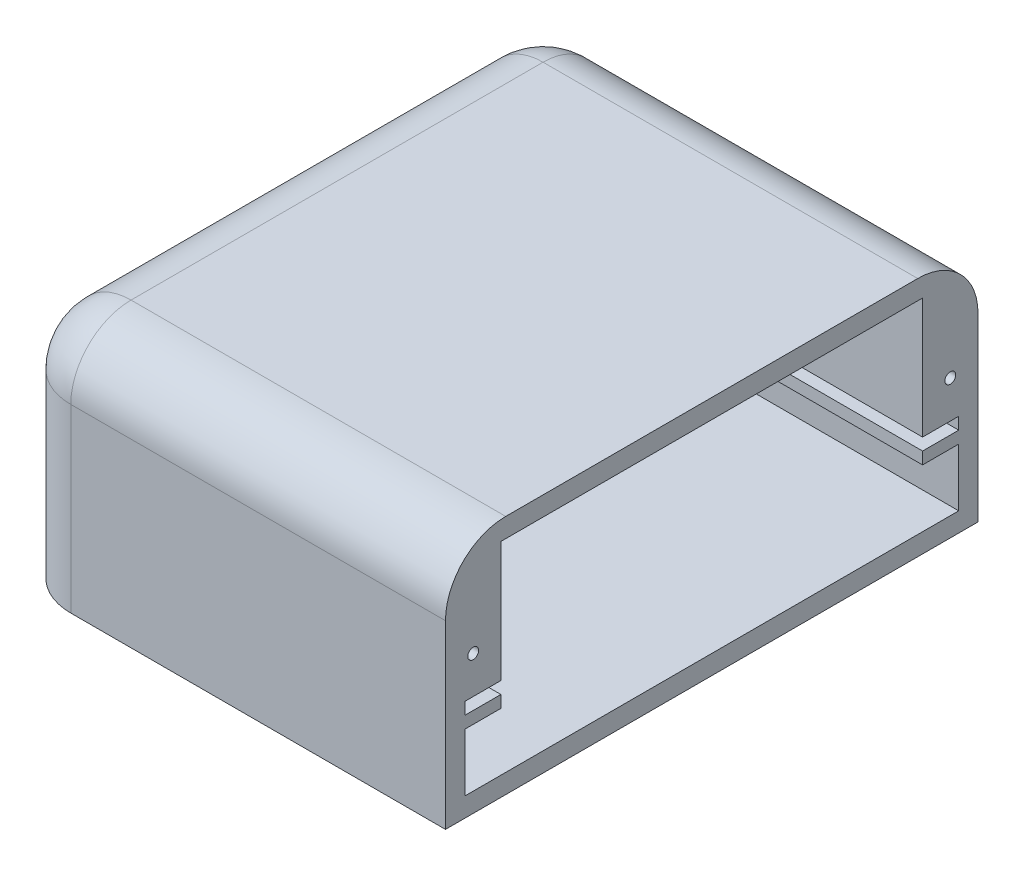
ISO-10303-21;
HEADER;
FILE_DESCRIPTION(('STEP AP214'),'2;1');
FILE_NAME('part.step','',(''),(''),'','','');
FILE_SCHEMA(('AUTOMOTIVE_DESIGN { 1 0 10303 214 1 1 1 1 }'));
ENDSEC;
DATA;
#1=APPLICATION_CONTEXT('core data for automotive mechanical design processes');
#2=APPLICATION_PROTOCOL_DEFINITION('international standard','automotive_design',2000,#1);
#3=PRODUCT_CONTEXT('',#1,'mechanical');
#4=PRODUCT('Part','Part','',(#3));
#5=PRODUCT_RELATED_PRODUCT_CATEGORY('part','',(#4));
#6=PRODUCT_DEFINITION_FORMATION('','',#4);
#7=PRODUCT_DEFINITION_CONTEXT('part definition',#1,'design');
#8=PRODUCT_DEFINITION('design','',#6,#7);
#9=PRODUCT_DEFINITION_SHAPE('','',#8);
#10=(LENGTH_UNIT() NAMED_UNIT(*) SI_UNIT(.MILLI.,.METRE.));
#11=(NAMED_UNIT(*) PLANE_ANGLE_UNIT() SI_UNIT($,.RADIAN.));
#12=(NAMED_UNIT(*) SI_UNIT($,.STERADIAN.) SOLID_ANGLE_UNIT());
#13=UNCERTAINTY_MEASURE_WITH_UNIT(LENGTH_MEASURE(1.E-05),#10,'distance_accuracy_value','');
#14=(GEOMETRIC_REPRESENTATION_CONTEXT(3) GLOBAL_UNCERTAINTY_ASSIGNED_CONTEXT((#13)) GLOBAL_UNIT_ASSIGNED_CONTEXT((#10,
#11,#12)) REPRESENTATION_CONTEXT('',''));
#15=CARTESIAN_POINT('',(0.,0.,0.));
#16=DIRECTION('',(0.,0.,1.));
#17=DIRECTION('',(1.,0.,0.));
#18=AXIS2_PLACEMENT_3D('',#15,#16,#17);
#19=CARTESIAN_POINT('',(72.2,40.,0.));
#20=DIRECTION('',(-1.,0.,0.));
#21=DIRECTION('',(0.,0.,1.));
#22=AXIS2_PLACEMENT_3D('',#19,#20,#21);
#23=PLANE('',#22);
#24=DIRECTION('',(0.,-1.,0.));
#25=VECTOR('',#24,1.);
#26=CARTESIAN_POINT('',(72.2,0.,-79.2));
#27=LINE('',#26,#25);
#28=CARTESIAN_POINT('',(72.2,36.8,-79.2));
#29=VERTEX_POINT('',#28);
#30=CARTESIAN_POINT('',(72.2,16.8,-79.2));
#31=VERTEX_POINT('',#30);
#32=EDGE_CURVE('E221',#29,#31,#27,.T.);
#33=ORIENTED_EDGE('',*,*,#32,.T.);
#34=DIRECTION('',(0.,0.,1.));
#35=VECTOR('',#34,1.);
#36=CARTESIAN_POINT('',(72.2,16.8,0.));
#37=LINE('',#36,#35);
#38=CARTESIAN_POINT('',(72.2,16.8,-85.2));
#39=VERTEX_POINT('',#38);
#40=EDGE_CURVE('E230',#39,#31,#37,.T.);
#41=ORIENTED_EDGE('',*,*,#40,.F.);
#42=DIRECTION('',(0.,1.,0.));
#43=VECTOR('',#42,1.);
#44=CARTESIAN_POINT('',(72.2,0.,-85.2));
#45=LINE('',#44,#43);
#46=CARTESIAN_POINT('',(72.2,14.8,-85.2));
#47=VERTEX_POINT('',#46);
#48=EDGE_CURVE('E234',#47,#39,#45,.T.);
#49=ORIENTED_EDGE('',*,*,#48,.F.);
#50=DIRECTION('',(0.,0.,1.));
#51=VECTOR('',#50,1.);
#52=CARTESIAN_POINT('',(72.2,14.8,0.));
#53=LINE('',#52,#51);
#54=CARTESIAN_POINT('',(72.2,14.8,-79.2));
#55=VERTEX_POINT('',#54);
#56=EDGE_CURVE('E327',#47,#55,#53,.T.);
#57=ORIENTED_EDGE('',*,*,#56,.T.);
#58=DIRECTION('',(0.,-1.,0.));
#59=VECTOR('',#58,1.);
#60=CARTESIAN_POINT('',(72.2,0.,-79.2));
#61=LINE('',#60,#59);
#62=CARTESIAN_POINT('',(72.2,12.8,-79.2));
#63=VERTEX_POINT('',#62);
#64=EDGE_CURVE('E323',#55,#63,#61,.T.);
#65=ORIENTED_EDGE('',*,*,#64,.T.);
#66=DIRECTION('',(0.,0.,1.));
#67=VECTOR('',#66,1.);
#68=CARTESIAN_POINT('',(72.2,12.8,0.));
#69=LINE('',#68,#67);
#70=CARTESIAN_POINT('',(72.2,12.8,-85.2));
#71=VERTEX_POINT('',#70);
#72=EDGE_CURVE('E319',#71,#63,#69,.T.);
#73=ORIENTED_EDGE('',*,*,#72,.F.);
#74=CARTESIAN_POINT('',(72.2,3.2,-85.2));
#75=VERTEX_POINT('',#74);
#76=EDGE_CURVE('E315',#75,#71,#45,.T.);
#77=ORIENTED_EDGE('',*,*,#76,.F.);
#78=DIRECTION('',(0.,0.,-1.));
#79=VECTOR('',#78,1.);
#80=CARTESIAN_POINT('',(72.2,3.2,0.));
#81=LINE('',#80,#79);
#82=CARTESIAN_POINT('',(72.2,3.2,-3.2));
#83=VERTEX_POINT('',#82);
#84=EDGE_CURVE('E311',#83,#75,#81,.T.);
#85=ORIENTED_EDGE('',*,*,#84,.F.);
#86=DIRECTION('',(0.,1.,0.));
#87=VECTOR('',#86,1.);
#88=CARTESIAN_POINT('',(72.2,0.,-3.2));
#89=LINE('',#88,#87);
#90=CARTESIAN_POINT('',(72.2,12.8,-3.2));
#91=VERTEX_POINT('',#90);
#92=EDGE_CURVE('E299',#83,#91,#89,.T.);
#93=ORIENTED_EDGE('',*,*,#92,.T.);
#94=DIRECTION('',(0.,0.,-1.));
#95=VECTOR('',#94,1.);
#96=CARTESIAN_POINT('',(72.2,12.8,0.));
#97=LINE('',#96,#95);
#98=CARTESIAN_POINT('',(72.2,12.8,-9.2));
#99=VERTEX_POINT('',#98);
#100=EDGE_CURVE('E307',#91,#99,#97,.T.);
#101=ORIENTED_EDGE('',*,*,#100,.T.);
#102=DIRECTION('',(0.,-1.,0.));
#103=VECTOR('',#102,1.);
#104=CARTESIAN_POINT('',(72.2,0.,-9.2));
#105=LINE('',#104,#103);
#106=CARTESIAN_POINT('',(72.2,14.8,-9.2));
#107=VERTEX_POINT('',#106);
#108=EDGE_CURVE('E303',#107,#99,#105,.T.);
#109=ORIENTED_EDGE('',*,*,#108,.F.);
#110=DIRECTION('',(0.,0.,-1.));
#111=VECTOR('',#110,1.);
#112=CARTESIAN_POINT('',(72.2,14.8,0.));
#113=LINE('',#112,#111);
#114=CARTESIAN_POINT('',(72.2,14.8,-3.2));
#115=VERTEX_POINT('',#114);
#116=EDGE_CURVE('E298',#115,#107,#113,.T.);
#117=ORIENTED_EDGE('',*,*,#116,.F.);
#118=CARTESIAN_POINT('',(72.2,16.8,-3.2));
#119=VERTEX_POINT('',#118);
#120=EDGE_CURVE('E294',#115,#119,#89,.T.);
#121=ORIENTED_EDGE('',*,*,#120,.T.);
#122=DIRECTION('',(0.,0.,-1.));
#123=VECTOR('',#122,1.);
#124=CARTESIAN_POINT('',(72.2,16.8,0.));
#125=LINE('',#124,#123);
#126=CARTESIAN_POINT('',(72.2,16.8,-9.2));
#127=VERTEX_POINT('',#126);
#128=EDGE_CURVE('E290',#119,#127,#125,.T.);
#129=ORIENTED_EDGE('',*,*,#128,.T.);
#130=DIRECTION('',(0.,-1.,0.));
#131=VECTOR('',#130,1.);
#132=CARTESIAN_POINT('',(72.2,0.,-9.20000000000001));
#133=LINE('',#132,#131);
#134=CARTESIAN_POINT('',(72.2,36.8,-9.2));
#135=VERTEX_POINT('',#134);
#136=EDGE_CURVE('E286',#135,#127,#133,.T.);
#137=ORIENTED_EDGE('',*,*,#136,.F.);
#138=DIRECTION('',(0.,0.,-1.));
#139=VECTOR('',#138,1.);
#140=CARTESIAN_POINT('',(72.2,36.8,0.));
#141=LINE('',#140,#139);
#142=EDGE_CURVE('E283',#135,#29,#141,.T.);
#143=ORIENTED_EDGE('',*,*,#142,.T.);
#144=EDGE_LOOP('',(#33,#41,#49,#57,#65,#73,#77,#85,#93,#101,#109,#117,#121,#129,#137,#143));
#145=FACE_BOUND('',#144,.T.);
#146=DIRECTION('',(0.,0.,-1.));
#147=VECTOR('',#146,1.);
#148=CARTESIAN_POINT('',(72.2,40.,0.));
#149=LINE('',#148,#147);
#150=CARTESIAN_POINT('',(72.2,40.,-10.));
#151=VERTEX_POINT('',#150);
#152=CARTESIAN_POINT('',(72.2,40.,-78.4));
#153=VERTEX_POINT('',#152);
#154=EDGE_CURVE('E376',#151,#153,#149,.T.);
#155=ORIENTED_EDGE('',*,*,#154,.F.);
#156=CARTESIAN_POINT('',(72.2,30.,-10.));
#157=DIRECTION('',(-1.,0.,0.));
#158=DIRECTION('',(0.,0.,1.));
#159=AXIS2_PLACEMENT_3D('',#156,#157,#158);
#160=CIRCLE('',#159,10.);
#161=CARTESIAN_POINT('',(72.2,30.,0.));
#162=VERTEX_POINT('',#161);
#163=EDGE_CURVE('E11',#151,#162,#160,.F.);
#164=ORIENTED_EDGE('',*,*,#163,.T.);
#165=DIRECTION('',(0.,-1.,0.));
#166=VECTOR('',#165,1.);
#167=CARTESIAN_POINT('',(72.2,40.,0.));
#168=LINE('',#167,#166);
#169=CARTESIAN_POINT('',(72.2,0.,0.));
#170=VERTEX_POINT('',#169);
#171=EDGE_CURVE('E397',#162,#170,#168,.T.);
#172=ORIENTED_EDGE('',*,*,#171,.T.);
#173=DIRECTION('',(0.,0.,-1.));
#174=VECTOR('',#173,1.);
#175=CARTESIAN_POINT('',(72.2,0.,0.));
#176=LINE('',#175,#174);
#177=CARTESIAN_POINT('',(72.2,0.,-88.4));
#178=VERTEX_POINT('',#177);
#179=EDGE_CURVE('E388',#170,#178,#176,.T.);
#180=ORIENTED_EDGE('',*,*,#179,.T.);
#181=DIRECTION('',(0.,-1.,0.));
#182=VECTOR('',#181,1.);
#183=CARTESIAN_POINT('',(72.2,40.,-88.4));
#184=LINE('',#183,#182);
#185=CARTESIAN_POINT('',(72.2,30.,-88.4));
#186=VERTEX_POINT('',#185);
#187=EDGE_CURVE('E379',#186,#178,#184,.T.);
#188=ORIENTED_EDGE('',*,*,#187,.F.);
#189=CARTESIAN_POINT('',(72.2,30.,-78.4));
#190=DIRECTION('',(-1.,0.,0.));
#191=DIRECTION('',(0.,0.,1.));
#192=AXIS2_PLACEMENT_3D('',#189,#190,#191);
#193=CIRCLE('',#192,10.);
#194=EDGE_CURVE('E49',#186,#153,#193,.F.);
#195=ORIENTED_EDGE('',*,*,#194,.T.);
#196=EDGE_LOOP('',(#155,#164,#172,#180,#188,#195));
#197=FACE_BOUND('',#196,.T.);
#198=CARTESIAN_POINT('',(72.2,23.,-83.8));
#199=DIRECTION('',(1.,0.,0.));
#200=DIRECTION('',(0.,0.,-1.));
#201=AXIS2_PLACEMENT_3D('',#198,#199,#200);
#202=CIRCLE('',#201,0.900000000000003);
#203=CARTESIAN_POINT('',(72.2,23.,-84.7));
#204=VERTEX_POINT('',#203);
#205=EDGE_CURVE('E237',#204,#204,#202,.F.);
#206=ORIENTED_EDGE('',*,*,#205,.T.);
#207=EDGE_LOOP('',(#206));
#208=FACE_BOUND('',#207,.T.);
#209=CARTESIAN_POINT('',(72.2,23.,-4.6));
#210=DIRECTION('',(1.,0.,0.));
#211=DIRECTION('',(0.,0.,-1.));
#212=AXIS2_PLACEMENT_3D('',#209,#210,#211);
#213=CIRCLE('',#212,0.9);
#214=CARTESIAN_POINT('',(72.2,23.,-5.5));
#215=VERTEX_POINT('',#214);
#216=EDGE_CURVE('E598',#215,#215,#213,.T.);
#217=ORIENTED_EDGE('',*,*,#216,.F.);
#218=EDGE_LOOP('',(#217));
#219=FACE_BOUND('',#218,.T.);
#220=ADVANCED_FACE('F39',(#145,#197,#208,#219),#23,.F.);
#221=CARTESIAN_POINT('',(0.,40.,0.));
#222=DIRECTION('',(1.,0.,0.));
#223=DIRECTION('',(0.,0.,-1.));
#224=AXIS2_PLACEMENT_3D('',#221,#222,#223);
#225=PLANE('',#224);
#226=DIRECTION('',(0.,0.,1.));
#227=VECTOR('',#226,1.);
#228=CARTESIAN_POINT('',(0.,0.,0.));
#229=LINE('',#228,#227);
#230=CARTESIAN_POINT('',(0.,0.,-78.4));
#231=VERTEX_POINT('',#230);
#232=CARTESIAN_POINT('',(0.,0.,-10.));
#233=VERTEX_POINT('',#232);
#234=EDGE_CURVE('E334',#231,#233,#229,.T.);
#235=ORIENTED_EDGE('',*,*,#234,.T.);
#236=DIRECTION('',(0.,-1.,0.));
#237=VECTOR('',#236,1.);
#238=CARTESIAN_POINT('',(0.,40.,-10.));
#239=LINE('',#238,#237);
#240=CARTESIAN_POINT('',(0.,30.,-10.));
#241=VERTEX_POINT('',#240);
#242=EDGE_CURVE('E419',#233,#241,#239,.F.);
#243=ORIENTED_EDGE('',*,*,#242,.T.);
#244=DIRECTION('',(0.,0.,1.));
#245=VECTOR('',#244,1.);
#246=CARTESIAN_POINT('',(0.,30.,0.));
#247=LINE('',#246,#245);
#248=CARTESIAN_POINT('',(0.,30.,-78.4));
#249=VERTEX_POINT('',#248);
#250=EDGE_CURVE('E413',#241,#249,#247,.F.);
#251=ORIENTED_EDGE('',*,*,#250,.T.);
#252=DIRECTION('',(0.,-1.,0.));
#253=VECTOR('',#252,1.);
#254=CARTESIAN_POINT('',(0.,40.,-78.4));
#255=LINE('',#254,#253);
#256=EDGE_CURVE('E416',#249,#231,#255,.T.);
#257=ORIENTED_EDGE('',*,*,#256,.T.);
#258=EDGE_LOOP('',(#235,#243,#251,#257));
#259=FACE_BOUND('',#258,.T.);
#260=ADVANCED_FACE('F499',(#259),#225,.F.);
#261=CARTESIAN_POINT('',(0.,40.,0.));
#262=DIRECTION('',(0.,0.,-1.));
#263=DIRECTION('',(-1.,0.,0.));
#264=AXIS2_PLACEMENT_3D('',#261,#262,#263);
#265=PLANE('',#264);
#266=DIRECTION('',(1.,0.,0.));
#267=VECTOR('',#266,1.);
#268=CARTESIAN_POINT('',(0.,30.,0.));
#269=LINE('',#268,#267);
#270=CARTESIAN_POINT('',(10.,30.,0.));
#271=VERTEX_POINT('',#270);
#272=EDGE_CURVE('E400',#162,#271,#269,.F.);
#273=ORIENTED_EDGE('',*,*,#272,.T.);
#274=DIRECTION('',(0.,-1.,0.));
#275=VECTOR('',#274,1.);
#276=CARTESIAN_POINT('',(10.,40.,0.));
#277=LINE('',#276,#275);
#278=CARTESIAN_POINT('',(10.,0.,0.));
#279=VERTEX_POINT('',#278);
#280=EDGE_CURVE('E403',#271,#279,#277,.T.);
#281=ORIENTED_EDGE('',*,*,#280,.T.);
#282=DIRECTION('',(1.,0.,0.));
#283=VECTOR('',#282,1.);
#284=CARTESIAN_POINT('',(0.,0.,0.));
#285=LINE('',#284,#283);
#286=EDGE_CURVE('E384',#279,#170,#285,.T.);
#287=ORIENTED_EDGE('',*,*,#286,.T.);
#288=ORIENTED_EDGE('',*,*,#171,.F.);
#289=EDGE_LOOP('',(#273,#281,#287,#288));
#290=FACE_BOUND('',#289,.T.);
#291=ADVANCED_FACE('F503',(#290),#265,.F.);
#292=CARTESIAN_POINT('',(0.,40.,-88.4));
#293=DIRECTION('',(0.,0.,1.));
#294=DIRECTION('',(1.,0.,0.));
#295=AXIS2_PLACEMENT_3D('',#292,#293,#294);
#296=PLANE('',#295);
#297=DIRECTION('',(-1.,0.,0.));
#298=VECTOR('',#297,1.);
#299=CARTESIAN_POINT('',(0.,0.,-88.4));
#300=LINE('',#299,#298);
#301=CARTESIAN_POINT('',(10.,0.,-88.4));
#302=VERTEX_POINT('',#301);
#303=EDGE_CURVE('E380',#178,#302,#300,.T.);
#304=ORIENTED_EDGE('',*,*,#303,.T.);
#305=DIRECTION('',(0.,-1.,0.));
#306=VECTOR('',#305,1.);
#307=CARTESIAN_POINT('',(10.,40.,-88.4));
#308=LINE('',#307,#306);
#309=CARTESIAN_POINT('',(10.,30.,-88.4));
#310=VERTEX_POINT('',#309);
#311=EDGE_CURVE('E425',#302,#310,#308,.F.);
#312=ORIENTED_EDGE('',*,*,#311,.T.);
#313=DIRECTION('',(-1.,0.,0.));
#314=VECTOR('',#313,1.);
#315=CARTESIAN_POINT('',(0.,30.,-88.4));
#316=LINE('',#315,#314);
#317=EDGE_CURVE('E422',#310,#186,#316,.F.);
#318=ORIENTED_EDGE('',*,*,#317,.T.);
#319=ORIENTED_EDGE('',*,*,#187,.T.);
#320=EDGE_LOOP('',(#304,#312,#318,#319));
#321=FACE_BOUND('',#320,.T.);
#322=ADVANCED_FACE('F489',(#321),#296,.F.);
#323=CARTESIAN_POINT('',(0.,40.,0.));
#324=DIRECTION('',(0.,-1.,0.));
#325=DIRECTION('',(0.,0.,-1.));
#326=AXIS2_PLACEMENT_3D('',#323,#324,#325);
#327=PLANE('',#326);
#328=DIRECTION('',(0.,0.,1.));
#329=VECTOR('',#328,1.);
#330=CARTESIAN_POINT('',(10.,40.,0.));
#331=LINE('',#330,#329);
#332=CARTESIAN_POINT('',(10.,40.,-78.4));
#333=VERTEX_POINT('',#332);
#334=CARTESIAN_POINT('',(10.,40.,-10.));
#335=VERTEX_POINT('',#334);
#336=EDGE_CURVE('E57',#333,#335,#331,.T.);
#337=ORIENTED_EDGE('',*,*,#336,.T.);
#338=DIRECTION('',(1.,0.,0.));
#339=VECTOR('',#338,1.);
#340=CARTESIAN_POINT('',(0.,40.,-10.));
#341=LINE('',#340,#339);
#342=EDGE_CURVE('E432',#335,#151,#341,.T.);
#343=ORIENTED_EDGE('',*,*,#342,.T.);
#344=ORIENTED_EDGE('',*,*,#154,.T.);
#345=DIRECTION('',(-1.,0.,0.));
#346=VECTOR('',#345,1.);
#347=CARTESIAN_POINT('',(0.,40.,-78.4));
#348=LINE('',#347,#346);
#349=EDGE_CURVE('E62',#153,#333,#348,.T.);
#350=ORIENTED_EDGE('',*,*,#349,.T.);
#351=EDGE_LOOP('',(#337,#343,#344,#350));
#352=FACE_BOUND('',#351,.T.);
#353=ADVANCED_FACE('F479',(#352),#327,.F.);
#354=CARTESIAN_POINT('',(0.,0.,0.));
#355=DIRECTION('',(0.,-1.,0.));
#356=DIRECTION('',(0.,0.,-1.));
#357=AXIS2_PLACEMENT_3D('',#354,#355,#356);
#358=PLANE('',#357);
#359=ORIENTED_EDGE('',*,*,#286,.F.);
#360=CARTESIAN_POINT('',(10.,0.,-10.));
#361=DIRECTION('',(0.,-1.,0.));
#362=DIRECTION('',(0.,0.,-1.));
#363=AXIS2_PLACEMENT_3D('',#360,#361,#362);
#364=CIRCLE('',#363,10.);
#365=EDGE_CURVE('E410',#279,#233,#364,.T.);
#366=ORIENTED_EDGE('',*,*,#365,.T.);
#367=ORIENTED_EDGE('',*,*,#234,.F.);
#368=CARTESIAN_POINT('',(10.,0.,-78.4));
#369=DIRECTION('',(0.,-1.,0.));
#370=DIRECTION('',(0.,0.,-1.));
#371=AXIS2_PLACEMENT_3D('',#368,#369,#370);
#372=CIRCLE('',#371,10.);
#373=EDGE_CURVE('E407',#231,#302,#372,.T.);
#374=ORIENTED_EDGE('',*,*,#373,.T.);
#375=ORIENTED_EDGE('',*,*,#303,.F.);
#376=ORIENTED_EDGE('',*,*,#179,.F.);
#377=EDGE_LOOP('',(#359,#366,#367,#374,#375,#376));
#378=FACE_BOUND('',#377,.T.);
#379=ADVANCED_FACE('F495',(#378),#358,.T.);
#380=CARTESIAN_POINT('',(3.19999999999999,0.,-79.2));
#381=DIRECTION('',(0.,0.,1.));
#382=DIRECTION('',(0.,-1.,0.));
#383=AXIS2_PLACEMENT_3D('',#380,#381,#382);
#384=PLANE('',#383);
#385=ORIENTED_EDGE('',*,*,#32,.F.);
#386=DIRECTION('',(1.,0.,0.));
#387=VECTOR('',#386,1.);
#388=CARTESIAN_POINT('',(3.19999999999999,36.8,-79.2));
#389=LINE('',#388,#387);
#390=CARTESIAN_POINT('',(3.19999999999999,36.8,-79.2));
#391=VERTEX_POINT('',#390);
#392=EDGE_CURVE('E206',#391,#29,#389,.T.);
#393=ORIENTED_EDGE('',*,*,#392,.F.);
#394=DIRECTION('',(0.,-1.,0.));
#395=VECTOR('',#394,1.);
#396=CARTESIAN_POINT('',(3.19999999999999,0.,-79.2));
#397=LINE('',#396,#395);
#398=CARTESIAN_POINT('',(3.19999999999999,16.8,-79.2));
#399=VERTEX_POINT('',#398);
#400=EDGE_CURVE('E215',#391,#399,#397,.T.);
#401=ORIENTED_EDGE('',*,*,#400,.T.);
#402=DIRECTION('',(1.,0.,0.));
#403=VECTOR('',#402,1.);
#404=CARTESIAN_POINT('',(3.19999999999999,16.8,-79.2));
#405=LINE('',#404,#403);
#406=EDGE_CURVE('E331',#399,#31,#405,.T.);
#407=ORIENTED_EDGE('',*,*,#406,.T.);
#408=EDGE_LOOP('',(#385,#393,#401,#407));
#409=FACE_BOUND('',#408,.T.);
#410=ADVANCED_FACE('F218',(#409),#384,.T.);
#411=CARTESIAN_POINT('',(3.19999999999999,16.8,0.));
#412=DIRECTION('',(0.,1.,0.));
#413=DIRECTION('',(0.,0.,1.));
#414=AXIS2_PLACEMENT_3D('',#411,#412,#413);
#415=PLANE('',#414);
#416=ORIENTED_EDGE('',*,*,#40,.T.);
#417=ORIENTED_EDGE('',*,*,#406,.F.);
#418=DIRECTION('',(0.,0.,1.));
#419=VECTOR('',#418,1.);
#420=CARTESIAN_POINT('',(3.19999999999999,16.8,0.));
#421=LINE('',#420,#419);
#422=CARTESIAN_POINT('',(3.19999999999999,16.8,-85.2));
#423=VERTEX_POINT('',#422);
#424=EDGE_CURVE('E223',#423,#399,#421,.T.);
#425=ORIENTED_EDGE('',*,*,#424,.F.);
#426=DIRECTION('',(1.,0.,0.));
#427=VECTOR('',#426,1.);
#428=CARTESIAN_POINT('',(3.19999999999999,16.8,-85.2));
#429=LINE('',#428,#427);
#430=EDGE_CURVE('E335',#423,#39,#429,.T.);
#431=ORIENTED_EDGE('',*,*,#430,.T.);
#432=EDGE_LOOP('',(#416,#417,#425,#431));
#433=FACE_BOUND('',#432,.T.);
#434=ADVANCED_FACE('F524',(#433),#415,.F.);
#435=CARTESIAN_POINT('',(3.19999999999999,0.,-85.2));
#436=DIRECTION('',(0.,0.,-1.));
#437=DIRECTION('',(-1.,0.,0.));
#438=AXIS2_PLACEMENT_3D('',#435,#436,#437);
#439=PLANE('',#438);
#440=ORIENTED_EDGE('',*,*,#48,.T.);
#441=ORIENTED_EDGE('',*,*,#430,.F.);
#442=DIRECTION('',(0.,1.,0.));
#443=VECTOR('',#442,1.);
#444=CARTESIAN_POINT('',(3.19999999999999,0.,-85.2));
#445=LINE('',#444,#443);
#446=CARTESIAN_POINT('',(3.19999999999999,14.8,-85.2));
#447=VERTEX_POINT('',#446);
#448=EDGE_CURVE('E269',#447,#423,#445,.T.);
#449=ORIENTED_EDGE('',*,*,#448,.F.);
#450=DIRECTION('',(1.,0.,0.));
#451=VECTOR('',#450,1.);
#452=CARTESIAN_POINT('',(3.19999999999999,14.8,-85.2));
#453=LINE('',#452,#451);
#454=EDGE_CURVE('E338',#447,#47,#453,.T.);
#455=ORIENTED_EDGE('',*,*,#454,.T.);
#456=EDGE_LOOP('',(#440,#441,#449,#455));
#457=FACE_BOUND('',#456,.T.);
#458=ADVANCED_FACE('F568',(#457),#439,.F.);
#459=CARTESIAN_POINT('',(3.19999999999999,14.8,0.));
#460=DIRECTION('',(0.,1.,0.));
#461=DIRECTION('',(0.,0.,1.));
#462=AXIS2_PLACEMENT_3D('',#459,#460,#461);
#463=PLANE('',#462);
#464=ORIENTED_EDGE('',*,*,#56,.F.);
#465=ORIENTED_EDGE('',*,*,#454,.F.);
#466=DIRECTION('',(0.,0.,1.));
#467=VECTOR('',#466,1.);
#468=CARTESIAN_POINT('',(3.19999999999999,14.8,0.));
#469=LINE('',#468,#467);
#470=CARTESIAN_POINT('',(3.19999999999999,14.8,-79.2));
#471=VERTEX_POINT('',#470);
#472=EDGE_CURVE('E276',#447,#471,#469,.T.);
#473=ORIENTED_EDGE('',*,*,#472,.T.);
#474=DIRECTION('',(1.,0.,0.));
#475=VECTOR('',#474,1.);
#476=CARTESIAN_POINT('',(3.19999999999999,14.8,-79.2));
#477=LINE('',#476,#475);
#478=EDGE_CURVE('E341',#471,#55,#477,.T.);
#479=ORIENTED_EDGE('',*,*,#478,.T.);
#480=EDGE_LOOP('',(#464,#465,#473,#479));
#481=FACE_BOUND('',#480,.T.);
#482=ADVANCED_FACE('F564',(#481),#463,.T.);
#483=CARTESIAN_POINT('',(3.19999999999999,0.,-79.2));
#484=DIRECTION('',(0.,0.,1.));
#485=DIRECTION('',(1.,0.,0.));
#486=AXIS2_PLACEMENT_3D('',#483,#484,#485);
#487=PLANE('',#486);
#488=ORIENTED_EDGE('',*,*,#64,.F.);
#489=ORIENTED_EDGE('',*,*,#478,.F.);
#490=DIRECTION('',(0.,-1.,0.));
#491=VECTOR('',#490,1.);
#492=CARTESIAN_POINT('',(3.19999999999999,0.,-79.2));
#493=LINE('',#492,#491);
#494=CARTESIAN_POINT('',(3.19999999999999,12.8,-79.2));
#495=VERTEX_POINT('',#494);
#496=EDGE_CURVE('E273',#471,#495,#493,.T.);
#497=ORIENTED_EDGE('',*,*,#496,.T.);
#498=DIRECTION('',(1.,0.,0.));
#499=VECTOR('',#498,1.);
#500=CARTESIAN_POINT('',(3.19999999999999,12.8,-79.2));
#501=LINE('',#500,#499);
#502=EDGE_CURVE('E344',#495,#63,#501,.T.);
#503=ORIENTED_EDGE('',*,*,#502,.T.);
#504=EDGE_LOOP('',(#488,#489,#497,#503));
#505=FACE_BOUND('',#504,.T.);
#506=ADVANCED_FACE('F560',(#505),#487,.T.);
#507=CARTESIAN_POINT('',(3.19999999999999,12.8,0.));
#508=DIRECTION('',(0.,1.,0.));
#509=DIRECTION('',(0.,0.,1.));
#510=AXIS2_PLACEMENT_3D('',#507,#508,#509);
#511=PLANE('',#510);
#512=ORIENTED_EDGE('',*,*,#72,.T.);
#513=ORIENTED_EDGE('',*,*,#502,.F.);
#514=DIRECTION('',(0.,0.,1.));
#515=VECTOR('',#514,1.);
#516=CARTESIAN_POINT('',(3.19999999999999,12.8,0.));
#517=LINE('',#516,#515);
#518=CARTESIAN_POINT('',(3.19999999999999,12.8,-85.2));
#519=VERTEX_POINT('',#518);
#520=EDGE_CURVE('E268',#519,#495,#517,.T.);
#521=ORIENTED_EDGE('',*,*,#520,.F.);
#522=DIRECTION('',(1.,0.,0.));
#523=VECTOR('',#522,1.);
#524=CARTESIAN_POINT('',(3.19999999999999,12.8,-85.2));
#525=LINE('',#524,#523);
#526=EDGE_CURVE('E347',#519,#71,#525,.T.);
#527=ORIENTED_EDGE('',*,*,#526,.T.);
#528=EDGE_LOOP('',(#512,#513,#521,#527));
#529=FACE_BOUND('',#528,.T.);
#530=ADVANCED_FACE('F557',(#529),#511,.F.);
#531=ORIENTED_EDGE('',*,*,#76,.T.);
#532=ORIENTED_EDGE('',*,*,#526,.F.);
#533=CARTESIAN_POINT('',(3.19999999999999,3.2,-85.2));
#534=VERTEX_POINT('',#533);
#535=EDGE_CURVE('E264',#534,#519,#445,.T.);
#536=ORIENTED_EDGE('',*,*,#535,.F.);
#537=DIRECTION('',(1.,0.,0.));
#538=VECTOR('',#537,1.);
#539=CARTESIAN_POINT('',(3.19999999999999,3.2,-85.2));
#540=LINE('',#539,#538);
#541=EDGE_CURVE('E350',#534,#75,#540,.T.);
#542=ORIENTED_EDGE('',*,*,#541,.T.);
#543=EDGE_LOOP('',(#531,#532,#536,#542));
#544=FACE_BOUND('',#543,.T.);
#545=ADVANCED_FACE('F555',(#544),#439,.F.);
#546=CARTESIAN_POINT('',(3.19999999999999,3.2,0.));
#547=DIRECTION('',(0.,-1.,0.));
#548=DIRECTION('',(0.,0.,-1.));
#549=AXIS2_PLACEMENT_3D('',#546,#547,#548);
#550=PLANE('',#549);
#551=ORIENTED_EDGE('',*,*,#84,.T.);
#552=ORIENTED_EDGE('',*,*,#541,.F.);
#553=DIRECTION('',(0.,0.,-1.));
#554=VECTOR('',#553,1.);
#555=CARTESIAN_POINT('',(3.19999999999999,3.2,0.));
#556=LINE('',#555,#554);
#557=CARTESIAN_POINT('',(3.19999999999999,3.2,-3.2));
#558=VERTEX_POINT('',#557);
#559=EDGE_CURVE('E260',#558,#534,#556,.T.);
#560=ORIENTED_EDGE('',*,*,#559,.F.);
#561=DIRECTION('',(1.,0.,0.));
#562=VECTOR('',#561,1.);
#563=CARTESIAN_POINT('',(3.19999999999999,3.2,-3.2));
#564=LINE('',#563,#562);
#565=EDGE_CURVE('E353',#558,#83,#564,.T.);
#566=ORIENTED_EDGE('',*,*,#565,.T.);
#567=EDGE_LOOP('',(#551,#552,#560,#566));
#568=FACE_BOUND('',#567,.T.);
#569=ADVANCED_FACE('F551',(#568),#550,.F.);
#570=CARTESIAN_POINT('',(3.19999999999999,0.,-3.2));
#571=DIRECTION('',(0.,0.,-1.));
#572=DIRECTION('',(-1.,0.,0.));
#573=AXIS2_PLACEMENT_3D('',#570,#571,#572);
#574=PLANE('',#573);
#575=ORIENTED_EDGE('',*,*,#92,.F.);
#576=ORIENTED_EDGE('',*,*,#565,.F.);
#577=DIRECTION('',(0.,1.,0.));
#578=VECTOR('',#577,1.);
#579=CARTESIAN_POINT('',(3.19999999999999,0.,-3.2));
#580=LINE('',#579,#578);
#581=CARTESIAN_POINT('',(3.19999999999999,12.8,-3.2));
#582=VERTEX_POINT('',#581);
#583=EDGE_CURVE('E249',#558,#582,#580,.T.);
#584=ORIENTED_EDGE('',*,*,#583,.T.);
#585=DIRECTION('',(1.,0.,0.));
#586=VECTOR('',#585,1.);
#587=CARTESIAN_POINT('',(3.19999999999999,12.8,-3.2));
#588=LINE('',#587,#586);
#589=EDGE_CURVE('E356',#582,#91,#588,.T.);
#590=ORIENTED_EDGE('',*,*,#589,.T.);
#591=EDGE_LOOP('',(#575,#576,#584,#590));
#592=FACE_BOUND('',#591,.T.);
#593=ADVANCED_FACE('F547',(#592),#574,.T.);
#594=CARTESIAN_POINT('',(3.19999999999999,12.8,0.));
#595=DIRECTION('',(0.,-1.,0.));
#596=DIRECTION('',(0.,0.,-1.));
#597=AXIS2_PLACEMENT_3D('',#594,#595,#596);
#598=PLANE('',#597);
#599=ORIENTED_EDGE('',*,*,#100,.F.);
#600=ORIENTED_EDGE('',*,*,#589,.F.);
#601=DIRECTION('',(0.,0.,-1.));
#602=VECTOR('',#601,1.);
#603=CARTESIAN_POINT('',(3.19999999999999,12.8,0.));
#604=LINE('',#603,#602);
#605=CARTESIAN_POINT('',(3.19999999999999,12.8,-9.2));
#606=VERTEX_POINT('',#605);
#607=EDGE_CURVE('E257',#582,#606,#604,.T.);
#608=ORIENTED_EDGE('',*,*,#607,.T.);
#609=DIRECTION('',(1.,0.,0.));
#610=VECTOR('',#609,1.);
#611=CARTESIAN_POINT('',(3.19999999999999,12.8,-9.2));
#612=LINE('',#611,#610);
#613=EDGE_CURVE('E359',#606,#99,#612,.T.);
#614=ORIENTED_EDGE('',*,*,#613,.T.);
#615=EDGE_LOOP('',(#599,#600,#608,#614));
#616=FACE_BOUND('',#615,.T.);
#617=ADVANCED_FACE('F543',(#616),#598,.T.);
#618=CARTESIAN_POINT('',(3.19999999999999,0.,-9.2));
#619=DIRECTION('',(0.,0.,1.));
#620=DIRECTION('',(1.,0.,0.));
#621=AXIS2_PLACEMENT_3D('',#618,#619,#620);
#622=PLANE('',#621);
#623=ORIENTED_EDGE('',*,*,#108,.T.);
#624=ORIENTED_EDGE('',*,*,#613,.F.);
#625=DIRECTION('',(0.,-1.,0.));
#626=VECTOR('',#625,1.);
#627=CARTESIAN_POINT('',(3.19999999999999,0.,-9.2));
#628=LINE('',#627,#626);
#629=CARTESIAN_POINT('',(3.19999999999999,14.8,-9.2));
#630=VERTEX_POINT('',#629);
#631=EDGE_CURVE('E253',#630,#606,#628,.T.);
#632=ORIENTED_EDGE('',*,*,#631,.F.);
#633=DIRECTION('',(1.,0.,0.));
#634=VECTOR('',#633,1.);
#635=CARTESIAN_POINT('',(3.19999999999999,14.8,-9.2));
#636=LINE('',#635,#634);
#637=EDGE_CURVE('E362',#630,#107,#636,.T.);
#638=ORIENTED_EDGE('',*,*,#637,.T.);
#639=EDGE_LOOP('',(#623,#624,#632,#638));
#640=FACE_BOUND('',#639,.T.);
#641=ADVANCED_FACE('F539',(#640),#622,.F.);
#642=CARTESIAN_POINT('',(3.19999999999999,14.8,0.));
#643=DIRECTION('',(0.,-1.,0.));
#644=DIRECTION('',(0.,0.,-1.));
#645=AXIS2_PLACEMENT_3D('',#642,#643,#644);
#646=PLANE('',#645);
#647=ORIENTED_EDGE('',*,*,#116,.T.);
#648=ORIENTED_EDGE('',*,*,#637,.F.);
#649=DIRECTION('',(0.,0.,-1.));
#650=VECTOR('',#649,1.);
#651=CARTESIAN_POINT('',(3.19999999999999,14.8,0.));
#652=LINE('',#651,#650);
#653=CARTESIAN_POINT('',(3.19999999999999,14.8,-3.2));
#654=VERTEX_POINT('',#653);
#655=EDGE_CURVE('E248',#654,#630,#652,.T.);
#656=ORIENTED_EDGE('',*,*,#655,.F.);
#657=DIRECTION('',(1.,0.,0.));
#658=VECTOR('',#657,1.);
#659=CARTESIAN_POINT('',(3.19999999999999,14.8,-3.2));
#660=LINE('',#659,#658);
#661=EDGE_CURVE('E365',#654,#115,#660,.T.);
#662=ORIENTED_EDGE('',*,*,#661,.T.);
#663=EDGE_LOOP('',(#647,#648,#656,#662));
#664=FACE_BOUND('',#663,.T.);
#665=ADVANCED_FACE('F536',(#664),#646,.F.);
#666=ORIENTED_EDGE('',*,*,#120,.F.);
#667=ORIENTED_EDGE('',*,*,#661,.F.);
#668=CARTESIAN_POINT('',(3.19999999999999,16.8,-3.2));
#669=VERTEX_POINT('',#668);
#670=EDGE_CURVE('E245',#654,#669,#580,.T.);
#671=ORIENTED_EDGE('',*,*,#670,.T.);
#672=DIRECTION('',(1.,0.,0.));
#673=VECTOR('',#672,1.);
#674=CARTESIAN_POINT('',(3.19999999999999,16.8,-3.2));
#675=LINE('',#674,#673);
#676=EDGE_CURVE('E368',#669,#119,#675,.T.);
#677=ORIENTED_EDGE('',*,*,#676,.T.);
#678=EDGE_LOOP('',(#666,#667,#671,#677));
#679=FACE_BOUND('',#678,.T.);
#680=ADVANCED_FACE('F534',(#679),#574,.T.);
#681=CARTESIAN_POINT('',(3.19999999999999,16.8,0.));
#682=DIRECTION('',(0.,-1.,0.));
#683=DIRECTION('',(0.,0.,-1.));
#684=AXIS2_PLACEMENT_3D('',#681,#682,#683);
#685=PLANE('',#684);
#686=ORIENTED_EDGE('',*,*,#128,.F.);
#687=ORIENTED_EDGE('',*,*,#676,.F.);
#688=DIRECTION('',(0.,0.,-1.));
#689=VECTOR('',#688,1.);
#690=CARTESIAN_POINT('',(3.19999999999999,16.8,0.));
#691=LINE('',#690,#689);
#692=CARTESIAN_POINT('',(3.19999999999999,16.8,-9.2));
#693=VERTEX_POINT('',#692);
#694=EDGE_CURVE('E242',#669,#693,#691,.T.);
#695=ORIENTED_EDGE('',*,*,#694,.T.);
#696=DIRECTION('',(1.,0.,0.));
#697=VECTOR('',#696,1.);
#698=CARTESIAN_POINT('',(3.19999999999999,16.8,-9.2));
#699=LINE('',#698,#697);
#700=EDGE_CURVE('E371',#693,#127,#699,.T.);
#701=ORIENTED_EDGE('',*,*,#700,.T.);
#702=EDGE_LOOP('',(#686,#687,#695,#701));
#703=FACE_BOUND('',#702,.T.);
#704=ADVANCED_FACE('F530',(#703),#685,.T.);
#705=CARTESIAN_POINT('',(3.19999999999999,0.,-9.20000000000001));
#706=DIRECTION('',(0.,0.,1.));
#707=DIRECTION('',(0.,-1.,0.));
#708=AXIS2_PLACEMENT_3D('',#705,#706,#707);
#709=PLANE('',#708);
#710=ORIENTED_EDGE('',*,*,#136,.T.);
#711=ORIENTED_EDGE('',*,*,#700,.F.);
#712=DIRECTION('',(0.,-1.,0.));
#713=VECTOR('',#712,1.);
#714=CARTESIAN_POINT('',(3.19999999999999,0.,-9.20000000000001));
#715=LINE('',#714,#713);
#716=CARTESIAN_POINT('',(3.19999999999999,36.8,-9.2));
#717=VERTEX_POINT('',#716);
#718=EDGE_CURVE('E214',#717,#693,#715,.T.);
#719=ORIENTED_EDGE('',*,*,#718,.F.);
#720=DIRECTION('',(1.,0.,0.));
#721=VECTOR('',#720,1.);
#722=CARTESIAN_POINT('',(3.19999999999999,36.8,-9.2));
#723=LINE('',#722,#721);
#724=EDGE_CURVE('E208',#717,#135,#723,.T.);
#725=ORIENTED_EDGE('',*,*,#724,.T.);
#726=EDGE_LOOP('',(#710,#711,#719,#725));
#727=FACE_BOUND('',#726,.T.);
#728=ADVANCED_FACE('F527',(#727),#709,.F.);
#729=CARTESIAN_POINT('',(3.19999999999999,36.8,0.));
#730=DIRECTION('',(0.,-1.,0.));
#731=DIRECTION('',(0.,0.,-1.));
#732=AXIS2_PLACEMENT_3D('',#729,#730,#731);
#733=PLANE('',#732);
#734=ORIENTED_EDGE('',*,*,#142,.F.);
#735=ORIENTED_EDGE('',*,*,#724,.F.);
#736=DIRECTION('',(0.,0.,-1.));
#737=VECTOR('',#736,1.);
#738=CARTESIAN_POINT('',(3.19999999999999,36.8,0.));
#739=LINE('',#738,#737);
#740=EDGE_CURVE('E202',#717,#391,#739,.T.);
#741=ORIENTED_EDGE('',*,*,#740,.T.);
#742=ORIENTED_EDGE('',*,*,#392,.T.);
#743=EDGE_LOOP('',(#734,#735,#741,#742));
#744=FACE_BOUND('',#743,.T.);
#745=ADVANCED_FACE('F205',(#744),#733,.T.);
#746=CARTESIAN_POINT('',(3.19999999999999,0.,0.));
#747=DIRECTION('',(1.,0.,0.));
#748=DIRECTION('',(0.,0.,-1.));
#749=AXIS2_PLACEMENT_3D('',#746,#747,#748);
#750=PLANE('',#749);
#751=ORIENTED_EDGE('',*,*,#400,.F.);
#752=ORIENTED_EDGE('',*,*,#740,.F.);
#753=ORIENTED_EDGE('',*,*,#718,.T.);
#754=ORIENTED_EDGE('',*,*,#694,.F.);
#755=ORIENTED_EDGE('',*,*,#670,.F.);
#756=ORIENTED_EDGE('',*,*,#655,.T.);
#757=ORIENTED_EDGE('',*,*,#631,.T.);
#758=ORIENTED_EDGE('',*,*,#607,.F.);
#759=ORIENTED_EDGE('',*,*,#583,.F.);
#760=ORIENTED_EDGE('',*,*,#559,.T.);
#761=ORIENTED_EDGE('',*,*,#535,.T.);
#762=ORIENTED_EDGE('',*,*,#520,.T.);
#763=ORIENTED_EDGE('',*,*,#496,.F.);
#764=ORIENTED_EDGE('',*,*,#472,.F.);
#765=ORIENTED_EDGE('',*,*,#448,.T.);
#766=ORIENTED_EDGE('',*,*,#424,.T.);
#767=EDGE_LOOP('',(#751,#752,#753,#754,#755,#756,#757,#758,#759,#760,#761,#762,#763,#764,#765,#766));
#768=FACE_BOUND('',#767,.T.);
#769=ADVANCED_FACE('F226',(#768),#750,.T.);
#770=CARTESIAN_POINT('',(10.,40.,-78.4));
#771=DIRECTION('',(0.,-1.,0.));
#772=DIRECTION('',(0.,0.,-1.));
#773=AXIS2_PLACEMENT_3D('',#770,#771,#772);
#774=CYLINDRICAL_SURFACE('',#773,10.);
#775=ORIENTED_EDGE('',*,*,#373,.F.);
#776=ORIENTED_EDGE('',*,*,#256,.F.);
#777=CARTESIAN_POINT('',(10.,30.,-78.4));
#778=DIRECTION('',(0.,1.,0.));
#779=DIRECTION('',(0.,0.,1.));
#780=AXIS2_PLACEMENT_3D('',#777,#778,#779);
#781=CIRCLE('',#780,10.);
#782=EDGE_CURVE('E43',#310,#249,#781,.T.);
#783=ORIENTED_EDGE('',*,*,#782,.F.);
#784=ORIENTED_EDGE('',*,*,#311,.F.);
#785=EDGE_LOOP('',(#775,#776,#783,#784));
#786=FACE_BOUND('',#785,.T.);
#787=ADVANCED_FACE('F41',(#786),#774,.T.);
#788=CARTESIAN_POINT('',(0.,30.,-78.4));
#789=DIRECTION('',(-1.,0.,0.));
#790=DIRECTION('',(0.,0.,1.));
#791=AXIS2_PLACEMENT_3D('',#788,#789,#790);
#792=CYLINDRICAL_SURFACE('',#791,10.);
#793=ORIENTED_EDGE('',*,*,#194,.F.);
#794=ORIENTED_EDGE('',*,*,#317,.F.);
#795=CARTESIAN_POINT('',(10.,30.,-78.4));
#796=DIRECTION('',(-1.,0.,0.));
#797=DIRECTION('',(0.,0.,1.));
#798=AXIS2_PLACEMENT_3D('',#795,#796,#797);
#799=CIRCLE('',#798,10.);
#800=EDGE_CURVE('E453',#333,#310,#799,.T.);
#801=ORIENTED_EDGE('',*,*,#800,.F.);
#802=ORIENTED_EDGE('',*,*,#349,.F.);
#803=EDGE_LOOP('',(#793,#794,#801,#802));
#804=FACE_BOUND('',#803,.T.);
#805=ADVANCED_FACE('F487',(#804),#792,.T.);
#806=CARTESIAN_POINT('',(10.,30.,-78.4));
#807=DIRECTION('',(0.,0.,-1.));
#808=DIRECTION('',(-1.,0.,0.));
#809=AXIS2_PLACEMENT_3D('',#806,#807,#808);
#810=SPHERICAL_SURFACE('',#809,10.);
#811=ORIENTED_EDGE('',*,*,#800,.T.);
#812=ORIENTED_EDGE('',*,*,#782,.T.);
#813=CARTESIAN_POINT('',(10.,30.,-78.4));
#814=DIRECTION('',(0.,0.,-1.));
#815=DIRECTION('',(-1.,0.,0.));
#816=AXIS2_PLACEMENT_3D('',#813,#814,#815);
#817=CIRCLE('',#816,10.);
#818=EDGE_CURVE('E450',#333,#249,#817,.F.);
#819=ORIENTED_EDGE('',*,*,#818,.F.);
#820=EDGE_LOOP('',(#811,#812,#819));
#821=FACE_BOUND('',#820,.T.);
#822=ADVANCED_FACE('F461',(#821),#810,.T.);
#823=CARTESIAN_POINT('',(10.,30.,0.));
#824=DIRECTION('',(0.,0.,1.));
#825=DIRECTION('',(1.,0.,0.));
#826=AXIS2_PLACEMENT_3D('',#823,#824,#825);
#827=CYLINDRICAL_SURFACE('',#826,10.);
#828=ORIENTED_EDGE('',*,*,#818,.T.);
#829=ORIENTED_EDGE('',*,*,#250,.F.);
#830=CARTESIAN_POINT('',(10.,30.,-10.));
#831=DIRECTION('',(0.,0.,1.));
#832=DIRECTION('',(1.,0.,0.));
#833=AXIS2_PLACEMENT_3D('',#830,#831,#832);
#834=CIRCLE('',#833,10.);
#835=EDGE_CURVE('E446',#335,#241,#834,.T.);
#836=ORIENTED_EDGE('',*,*,#835,.F.);
#837=ORIENTED_EDGE('',*,*,#336,.F.);
#838=EDGE_LOOP('',(#828,#829,#836,#837));
#839=FACE_BOUND('',#838,.T.);
#840=ADVANCED_FACE('F467',(#839),#827,.T.);
#841=CARTESIAN_POINT('',(0.,30.,-10.));
#842=DIRECTION('',(1.,0.,0.));
#843=DIRECTION('',(0.,0.,-1.));
#844=AXIS2_PLACEMENT_3D('',#841,#842,#843);
#845=CYLINDRICAL_SURFACE('',#844,10.);
#846=ORIENTED_EDGE('',*,*,#163,.F.);
#847=ORIENTED_EDGE('',*,*,#342,.F.);
#848=CARTESIAN_POINT('',(10.,30.,-10.));
#849=DIRECTION('',(-1.,0.,0.));
#850=DIRECTION('',(0.,0.,1.));
#851=AXIS2_PLACEMENT_3D('',#848,#849,#850);
#852=CIRCLE('',#851,10.);
#853=EDGE_CURVE('E441',#271,#335,#852,.T.);
#854=ORIENTED_EDGE('',*,*,#853,.F.);
#855=ORIENTED_EDGE('',*,*,#272,.F.);
#856=EDGE_LOOP('',(#846,#847,#854,#855));
#857=FACE_BOUND('',#856,.T.);
#858=ADVANCED_FACE('F477',(#857),#845,.T.);
#859=CARTESIAN_POINT('',(10.,30.,-10.));
#860=DIRECTION('',(0.,1.,0.));
#861=DIRECTION('',(0.,0.,1.));
#862=AXIS2_PLACEMENT_3D('',#859,#860,#861);
#863=SPHERICAL_SURFACE('',#862,10.);
#864=ORIENTED_EDGE('',*,*,#853,.T.);
#865=ORIENTED_EDGE('',*,*,#835,.T.);
#866=CARTESIAN_POINT('',(10.,30.,-10.));
#867=DIRECTION('',(0.,1.,0.));
#868=DIRECTION('',(0.,0.,1.));
#869=AXIS2_PLACEMENT_3D('',#866,#867,#868);
#870=CIRCLE('',#869,10.);
#871=EDGE_CURVE('E437',#271,#241,#870,.F.);
#872=ORIENTED_EDGE('',*,*,#871,.F.);
#873=EDGE_LOOP('',(#864,#865,#872));
#874=FACE_BOUND('',#873,.T.);
#875=ADVANCED_FACE('F472',(#874),#863,.T.);
#876=CARTESIAN_POINT('',(10.,40.,-10.));
#877=DIRECTION('',(0.,-1.,0.));
#878=DIRECTION('',(0.,0.,-1.));
#879=AXIS2_PLACEMENT_3D('',#876,#877,#878);
#880=CYLINDRICAL_SURFACE('',#879,10.);
#881=ORIENTED_EDGE('',*,*,#871,.T.);
#882=ORIENTED_EDGE('',*,*,#242,.F.);
#883=ORIENTED_EDGE('',*,*,#365,.F.);
#884=ORIENTED_EDGE('',*,*,#280,.F.);
#885=EDGE_LOOP('',(#881,#882,#883,#884));
#886=FACE_BOUND('',#885,.T.);
#887=ADVANCED_FACE('F501',(#886),#880,.T.);
#888=CARTESIAN_POINT('',(52.2,23.,-83.8));
#889=DIRECTION('',(1.,0.,0.));
#890=DIRECTION('',(0.,0.,-1.));
#891=AXIS2_PLACEMENT_3D('',#888,#889,#890);
#892=CYLINDRICAL_SURFACE('',#891,0.900000000000003);
#893=CARTESIAN_POINT('',(52.2,23.,-83.8));
#894=DIRECTION('',(1.,0.,0.));
#895=DIRECTION('',(0.,0.,-1.));
#896=AXIS2_PLACEMENT_3D('',#893,#894,#895);
#897=CIRCLE('',#896,0.900000000000003);
#898=CARTESIAN_POINT('',(52.2,23.,-84.7));
#899=VERTEX_POINT('',#898);
#900=EDGE_CURVE('E602',#899,#899,#897,.F.);
#901=ORIENTED_EDGE('',*,*,#900,.T.);
#902=EDGE_LOOP('',(#901));
#903=FACE_BOUND('',#902,.T.);
#904=ORIENTED_EDGE('',*,*,#205,.F.);
#905=EDGE_LOOP('',(#904));
#906=FACE_BOUND('',#905,.T.);
#907=ADVANCED_FACE('F578',(#903,#906),#892,.F.);
#908=CARTESIAN_POINT('',(52.2,0.,0.));
#909=DIRECTION('',(1.,0.,0.));
#910=DIRECTION('',(0.,0.,-1.));
#911=AXIS2_PLACEMENT_3D('',#908,#909,#910);
#912=PLANE('',#911);
#913=ORIENTED_EDGE('',*,*,#900,.F.);
#914=EDGE_LOOP('',(#913));
#915=FACE_BOUND('',#914,.T.);
#916=ADVANCED_FACE('F581',(#915),#912,.T.);
#917=CARTESIAN_POINT('',(52.2,23.,-4.6));
#918=DIRECTION('',(1.,0.,0.));
#919=DIRECTION('',(0.,0.,-1.));
#920=AXIS2_PLACEMENT_3D('',#917,#918,#919);
#921=CYLINDRICAL_SURFACE('',#920,0.9);
#922=CARTESIAN_POINT('',(52.2,23.,-4.6));
#923=DIRECTION('',(1.,0.,0.));
#924=DIRECTION('',(0.,0.,-1.));
#925=AXIS2_PLACEMENT_3D('',#922,#923,#924);
#926=CIRCLE('',#925,0.9);
#927=CARTESIAN_POINT('',(52.2,23.,-5.5));
#928=VERTEX_POINT('',#927);
#929=EDGE_CURVE('E442',#928,#928,#926,.T.);
#930=ORIENTED_EDGE('',*,*,#929,.F.);
#931=EDGE_LOOP('',(#930));
#932=FACE_BOUND('',#931,.T.);
#933=ORIENTED_EDGE('',*,*,#216,.T.);
#934=EDGE_LOOP('',(#933));
#935=FACE_BOUND('',#934,.T.);
#936=ADVANCED_FACE('F585',(#932,#935),#921,.F.);
#937=CARTESIAN_POINT('',(52.2,0.,0.));
#938=DIRECTION('',(1.,0.,0.));
#939=DIRECTION('',(0.,0.,-1.));
#940=AXIS2_PLACEMENT_3D('',#937,#938,#939);
#941=PLANE('',#940);
#942=ORIENTED_EDGE('',*,*,#929,.T.);
#943=EDGE_LOOP('',(#942));
#944=FACE_BOUND('',#943,.T.);
#945=ADVANCED_FACE('F589',(#944),#941,.T.);
#946=CLOSED_SHELL('',(#220,#260,#291,#322,#353,#379,#410,#434,#458,#482,#506,#530,#545,#569,
#593,#617,#641,#665,#680,#704,#728,#745,#769,#787,#805,#822,#840,#858,#875,#887,#907,#916,#936,#945));
#947=MANIFOLD_SOLID_BREP('B2',#946);
#948=ADVANCED_BREP_SHAPE_REPRESENTATION('',(#18,#947),#14);
#949=SHAPE_DEFINITION_REPRESENTATION(#9,#948);
ENDSEC;
END-ISO-10303-21;
